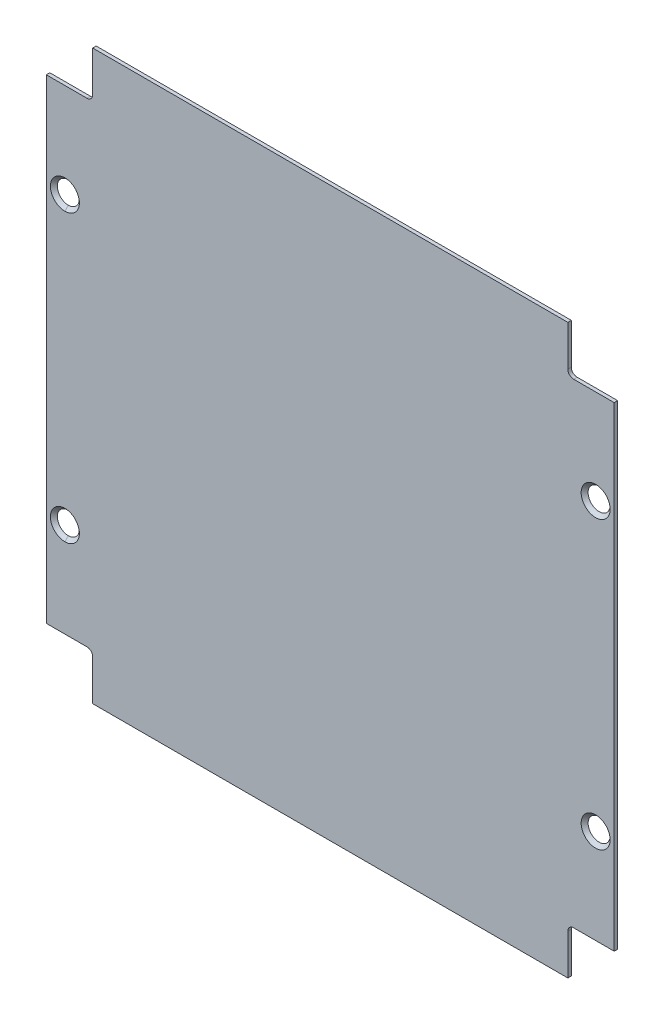
ISO-10303-21;
HEADER;
FILE_DESCRIPTION(('STEP AP214'),'2;1');
FILE_NAME('part.step','',(''),(''),'','','');
FILE_SCHEMA(('AUTOMOTIVE_DESIGN { 1 0 10303 214 1 1 1 1 }'));
ENDSEC;
DATA;
#1=APPLICATION_CONTEXT('core data for automotive mechanical design processes');
#2=APPLICATION_PROTOCOL_DEFINITION('international standard','automotive_design',2000,#1);
#3=PRODUCT_CONTEXT('',#1,'mechanical');
#4=PRODUCT('Part','Part','',(#3));
#5=PRODUCT_RELATED_PRODUCT_CATEGORY('part','',(#4));
#6=PRODUCT_DEFINITION_FORMATION('','',#4);
#7=PRODUCT_DEFINITION_CONTEXT('part definition',#1,'design');
#8=PRODUCT_DEFINITION('design','',#6,#7);
#9=PRODUCT_DEFINITION_SHAPE('','',#8);
#10=(LENGTH_UNIT() NAMED_UNIT(*) SI_UNIT(.MILLI.,.METRE.));
#11=(NAMED_UNIT(*) PLANE_ANGLE_UNIT() SI_UNIT($,.RADIAN.));
#12=(NAMED_UNIT(*) SI_UNIT($,.STERADIAN.) SOLID_ANGLE_UNIT());
#13=UNCERTAINTY_MEASURE_WITH_UNIT(LENGTH_MEASURE(1.E-05),#10,'distance_accuracy_value','');
#14=(GEOMETRIC_REPRESENTATION_CONTEXT(3) GLOBAL_UNCERTAINTY_ASSIGNED_CONTEXT((#13)) GLOBAL_UNIT_ASSIGNED_CONTEXT((#10,
#11,#12)) REPRESENTATION_CONTEXT('',''));
#15=CARTESIAN_POINT('',(0.,0.,0.));
#16=DIRECTION('',(0.,0.,1.));
#17=DIRECTION('',(1.,0.,0.));
#18=AXIS2_PLACEMENT_3D('',#15,#16,#17);
#19=CARTESIAN_POINT('',(50.0000000000032,-50.0000000000032,220.050000000009));
#20=DIRECTION('',(0.,0.,1.));
#21=DIRECTION('',(1.,0.,0.));
#22=AXIS2_PLACEMENT_3D('',#19,#20,#21);
#23=PLANE('',#22);
#24=CARTESIAN_POINT('',(4.20000000000099,-25.3000000000004,220.050000000009));
#25=DIRECTION('',(0.,0.,1.));
#26=DIRECTION('',(1.,0.,0.));
#27=AXIS2_PLACEMENT_3D('',#24,#25,#26);
#28=CIRCLE('',#27,2.50000738707968);
#29=CARTESIAN_POINT('',(4.20000000000098,-22.8000039421319,220.049994335404));
#30=VERTEX_POINT('',#29);
#31=CARTESIAN_POINT('',(4.20000000000098,-27.7999960578594,220.049994335404));
#32=VERTEX_POINT('',#31);
#33=EDGE_CURVE('E186',#30,#32,#28,.F.);
#34=ORIENTED_EDGE('',*,*,#33,.T.);
#35=CARTESIAN_POINT('',(4.20000000000098,-25.3000000000004,220.050000000009));
#36=DIRECTION('',(0.,0.,1.));
#37=DIRECTION('',(1.,0.,0.));
#38=AXIS2_PLACEMENT_3D('',#35,#36,#37);
#39=CIRCLE('',#38,2.50000738707967);
#40=EDGE_CURVE('E354',#32,#30,#39,.F.);
#41=ORIENTED_EDGE('',*,*,#40,.T.);
#42=EDGE_LOOP('',(#34,#41));
#43=FACE_BOUND('',#42,.T.);
#44=CARTESIAN_POINT('',(95.7999999999978,-25.3000000000004,220.050000000009));
#45=DIRECTION('',(0.,0.,1.));
#46=DIRECTION('',(1.,0.,0.));
#47=AXIS2_PLACEMENT_3D('',#44,#45,#46);
#48=CIRCLE('',#47,2.50000738711097);
#49=CARTESIAN_POINT('',(98.3000073871088,-25.3000000000004,220.050000000009));
#50=VERTEX_POINT('',#49);
#51=EDGE_CURVE('E359',#50,#50,#48,.F.);
#52=ORIENTED_EDGE('',*,*,#51,.T.);
#53=EDGE_LOOP('',(#52));
#54=FACE_BOUND('',#53,.T.);
#55=CARTESIAN_POINT('',(95.7999999999978,-74.700000000006,220.050000000009));
#56=DIRECTION('',(0.,0.,1.));
#57=DIRECTION('',(1.,0.,0.));
#58=AXIS2_PLACEMENT_3D('',#55,#56,#57);
#59=CIRCLE('',#58,2.50000738711097);
#60=CARTESIAN_POINT('',(98.3000073871088,-74.700000000006,220.050000000009));
#61=VERTEX_POINT('',#60);
#62=EDGE_CURVE('E201',#61,#61,#59,.F.);
#63=ORIENTED_EDGE('',*,*,#62,.T.);
#64=EDGE_LOOP('',(#63));
#65=FACE_BOUND('',#64,.T.);
#66=CARTESIAN_POINT('',(4.20000000000099,-74.700000000006,220.050000000009));
#67=DIRECTION('',(0.,0.,1.));
#68=DIRECTION('',(1.,0.,0.));
#69=AXIS2_PLACEMENT_3D('',#66,#67,#68);
#70=CIRCLE('',#69,2.50000738707968);
#71=CARTESIAN_POINT('',(4.20000000000098,-72.200003942137,220.049994335404));
#72=VERTEX_POINT('',#71);
#73=CARTESIAN_POINT('',(4.20000000000098,-77.1999960578627,220.049994335404));
#74=VERTEX_POINT('',#73);
#75=EDGE_CURVE('E196',#72,#74,#70,.F.);
#76=ORIENTED_EDGE('',*,*,#75,.T.);
#77=CARTESIAN_POINT('',(4.20000000000098,-74.700000000006,220.050000000009));
#78=DIRECTION('',(0.,0.,1.));
#79=DIRECTION('',(1.,0.,0.));
#80=AXIS2_PLACEMENT_3D('',#77,#78,#79);
#81=CIRCLE('',#80,2.50000738707967);
#82=EDGE_CURVE('E206',#74,#72,#81,.F.);
#83=ORIENTED_EDGE('',*,*,#82,.T.);
#84=EDGE_LOOP('',(#76,#83));
#85=FACE_BOUND('',#84,.T.);
#86=DIRECTION('',(0.,1.,0.));
#87=VECTOR('',#86,1.);
#88=CARTESIAN_POINT('',(8.99999999999956,-4.49999999999978,220.050000000009));
#89=LINE('',#88,#87);
#90=CARTESIAN_POINT('',(8.99999999999956,-1.00000000000006,220.050000000009));
#91=VERTEX_POINT('',#90);
#92=CARTESIAN_POINT('',(8.99999999999956,-8.00000000000102,220.050000000009));
#93=VERTEX_POINT('',#92);
#94=EDGE_CURVE('E207',#91,#93,#89,.F.);
#95=ORIENTED_EDGE('',*,*,#94,.T.);
#96=CARTESIAN_POINT('',(8.00000000000102,-8.00000000000102,220.050000000009));
#97=DIRECTION('',(0.,0.,1.));
#98=DIRECTION('',(1.,0.,0.));
#99=AXIS2_PLACEMENT_3D('',#96,#97,#98);
#100=CIRCLE('',#99,1.00000000000006);
#101=CARTESIAN_POINT('',(8.00000000000102,-8.99999999999956,220.050000000009));
#102=VERTEX_POINT('',#101);
#103=EDGE_CURVE('E20',#93,#102,#100,.F.);
#104=ORIENTED_EDGE('',*,*,#103,.T.);
#105=DIRECTION('',(1.,0.,0.));
#106=VECTOR('',#105,1.);
#107=CARTESIAN_POINT('',(4.49999999999978,-8.99999999999956,220.050000000009));
#108=LINE('',#107,#106);
#109=CARTESIAN_POINT('',(1.00000000000006,-8.99999999999956,220.050000000009));
#110=VERTEX_POINT('',#109);
#111=EDGE_CURVE('E293',#110,#102,#108,.T.);
#112=ORIENTED_EDGE('',*,*,#111,.F.);
#113=DIRECTION('',(0.,1.,0.));
#114=VECTOR('',#113,1.);
#115=CARTESIAN_POINT('',(1.00000000000006,-50.0000000000032,220.050000000009));
#116=LINE('',#115,#114);
#117=CARTESIAN_POINT('',(1.00000000000006,-90.9999999999916,220.050000000009));
#118=VERTEX_POINT('',#117);
#119=EDGE_CURVE('E156',#110,#118,#116,.F.);
#120=ORIENTED_EDGE('',*,*,#119,.T.);
#121=DIRECTION('',(1.,0.,0.));
#122=VECTOR('',#121,1.);
#123=CARTESIAN_POINT('',(4.49999999999978,-90.9999999999916,220.050000000009));
#124=LINE('',#123,#122);
#125=CARTESIAN_POINT('',(8.00000000000102,-90.9999999999896,220.050000000009));
#126=VERTEX_POINT('',#125);
#127=EDGE_CURVE('E283',#118,#126,#124,.T.);
#128=ORIENTED_EDGE('',*,*,#127,.T.);
#129=CARTESIAN_POINT('',(8.00000000000102,-91.9999999999876,220.050000000009));
#130=DIRECTION('',(0.,0.,1.));
#131=DIRECTION('',(1.,0.,0.));
#132=AXIS2_PLACEMENT_3D('',#129,#130,#131);
#133=CIRCLE('',#132,1.00000000000006);
#134=CARTESIAN_POINT('',(8.99999999999956,-91.9999999999876,220.050000000009));
#135=VERTEX_POINT('',#134);
#136=EDGE_CURVE('E279',#126,#135,#133,.F.);
#137=ORIENTED_EDGE('',*,*,#136,.T.);
#138=DIRECTION('',(0.,1.,0.));
#139=VECTOR('',#138,1.);
#140=CARTESIAN_POINT('',(8.99999999999956,-95.499999999999,220.050000000009));
#141=LINE('',#140,#139);
#142=CARTESIAN_POINT('',(8.99999999999956,-99.0000000000104,220.050000000009));
#143=VERTEX_POINT('',#142);
#144=EDGE_CURVE('E273',#135,#143,#141,.F.);
#145=ORIENTED_EDGE('',*,*,#144,.T.);
#146=DIRECTION('',(1.,0.,0.));
#147=VECTOR('',#146,1.);
#148=CARTESIAN_POINT('',(50.0000000000032,-99.0000000000104,220.050000000009));
#149=LINE('',#148,#147);
#150=CARTESIAN_POINT('',(90.9999999999916,-99.0000000000104,220.050000000009));
#151=VERTEX_POINT('',#150);
#152=EDGE_CURVE('E272',#143,#151,#149,.T.);
#153=ORIENTED_EDGE('',*,*,#152,.T.);
#154=DIRECTION('',(0.,1.,0.));
#155=VECTOR('',#154,1.);
#156=CARTESIAN_POINT('',(90.9999999999916,-95.499999999999,220.050000000009));
#157=LINE('',#156,#155);
#158=CARTESIAN_POINT('',(90.9999999999896,-91.9999999999876,220.050000000009));
#159=VERTEX_POINT('',#158);
#160=EDGE_CURVE('E259',#159,#151,#157,.F.);
#161=ORIENTED_EDGE('',*,*,#160,.F.);
#162=CARTESIAN_POINT('',(91.9999999999876,-91.9999999999876,220.050000000009));
#163=DIRECTION('',(0.,0.,1.));
#164=DIRECTION('',(1.,0.,0.));
#165=AXIS2_PLACEMENT_3D('',#162,#163,#164);
#166=CIRCLE('',#165,1.00000000000006);
#167=CARTESIAN_POINT('',(91.9999999999876,-90.9999999999916,220.050000000009));
#168=VERTEX_POINT('',#167);
#169=EDGE_CURVE('E253',#159,#168,#166,.F.);
#170=ORIENTED_EDGE('',*,*,#169,.T.);
#171=DIRECTION('',(1.,0.,0.));
#172=VECTOR('',#171,1.);
#173=CARTESIAN_POINT('',(95.499999999999,-90.9999999999916,220.050000000009));
#174=LINE('',#173,#172);
#175=CARTESIAN_POINT('',(99.0000000000104,-90.9999999999916,220.050000000009));
#176=VERTEX_POINT('',#175);
#177=EDGE_CURVE('E252',#168,#176,#174,.T.);
#178=ORIENTED_EDGE('',*,*,#177,.T.);
#179=DIRECTION('',(0.,1.,0.));
#180=VECTOR('',#179,1.);
#181=CARTESIAN_POINT('',(99.0000000000104,-50.0000000000032,220.050000000009));
#182=LINE('',#181,#180);
#183=CARTESIAN_POINT('',(99.0000000000104,-8.99999999999956,220.050000000009));
#184=VERTEX_POINT('',#183);
#185=EDGE_CURVE('E246',#184,#176,#182,.F.);
#186=ORIENTED_EDGE('',*,*,#185,.F.);
#187=DIRECTION('',(1.,0.,0.));
#188=VECTOR('',#187,1.);
#189=CARTESIAN_POINT('',(95.499999999999,-8.99999999999956,220.050000000009));
#190=LINE('',#189,#188);
#191=CARTESIAN_POINT('',(91.9999999999876,-9.00000000000032,220.050000000009));
#192=VERTEX_POINT('',#191);
#193=EDGE_CURVE('E234',#192,#184,#190,.T.);
#194=ORIENTED_EDGE('',*,*,#193,.F.);
#195=CARTESIAN_POINT('',(91.9999999999876,-8.00000000000102,220.050000000009));
#196=DIRECTION('',(0.,0.,1.));
#197=DIRECTION('',(1.,0.,0.));
#198=AXIS2_PLACEMENT_3D('',#195,#196,#197);
#199=CIRCLE('',#198,1.00000000000006);
#200=CARTESIAN_POINT('',(90.9999999999916,-8.00000000000102,220.050000000009));
#201=VERTEX_POINT('',#200);
#202=EDGE_CURVE('E231',#192,#201,#199,.F.);
#203=ORIENTED_EDGE('',*,*,#202,.T.);
#204=DIRECTION('',(0.,1.,0.));
#205=VECTOR('',#204,1.);
#206=CARTESIAN_POINT('',(90.9999999999916,-4.49999999999978,220.050000000009));
#207=LINE('',#206,#205);
#208=CARTESIAN_POINT('',(90.9999999999916,-1.00000000000006,220.050000000009));
#209=VERTEX_POINT('',#208);
#210=EDGE_CURVE('E227',#209,#201,#207,.F.);
#211=ORIENTED_EDGE('',*,*,#210,.F.);
#212=DIRECTION('',(1.,0.,0.));
#213=VECTOR('',#212,1.);
#214=CARTESIAN_POINT('',(50.0000000000032,-1.00000000000006,220.050000000009));
#215=LINE('',#214,#213);
#216=EDGE_CURVE('E121',#91,#209,#215,.T.);
#217=ORIENTED_EDGE('',*,*,#216,.F.);
#218=EDGE_LOOP('',(#95,#104,#112,#120,#128,#137,#145,#153,#161,#170,#178,#186,#194,#203,#211,#217));
#219=FACE_BOUND('',#218,.T.);
#220=ADVANCED_FACE('F17',(#43,#54,#65,#85,#219),#23,.T.);
#221=CARTESIAN_POINT('',(8.00000000000102,-8.00000000000102,219.283686926491));
#222=DIRECTION('',(0.,0.,1.));
#223=DIRECTION('',(1.,0.,0.));
#224=AXIS2_PLACEMENT_3D('',#221,#222,#223);
#225=CYLINDRICAL_SURFACE('',#224,1.00000000000006);
#226=ORIENTED_EDGE('',*,*,#103,.F.);
#227=DIRECTION('',(0.,0.,-1.));
#228=VECTOR('',#227,1.);
#229=CARTESIAN_POINT('',(8.99999999999956,-8.00000000000102,219.75000000001));
#230=LINE('',#229,#228);
#231=CARTESIAN_POINT('',(8.99999999999956,-8.00000000000102,219.450000000011));
#232=VERTEX_POINT('',#231);
#233=EDGE_CURVE('E204',#93,#232,#230,.T.);
#234=ORIENTED_EDGE('',*,*,#233,.T.);
#235=CARTESIAN_POINT('',(8.00000000000102,-8.00000000000102,219.450000000011));
#236=DIRECTION('',(0.,0.,1.));
#237=DIRECTION('',(1.,0.,0.));
#238=AXIS2_PLACEMENT_3D('',#235,#236,#237);
#239=CIRCLE('',#238,1.00000000000006);
#240=CARTESIAN_POINT('',(8.00000000000102,-8.99999999999956,219.450000000011));
#241=VERTEX_POINT('',#240);
#242=EDGE_CURVE('E174',#232,#241,#239,.F.);
#243=ORIENTED_EDGE('',*,*,#242,.T.);
#244=DIRECTION('',(0.,0.,1.));
#245=VECTOR('',#244,1.);
#246=CARTESIAN_POINT('',(8.00000000000102,-8.99999999999956,219.75000000001));
#247=LINE('',#246,#245);
#248=EDGE_CURVE('E160',#102,#241,#247,.F.);
#249=ORIENTED_EDGE('',*,*,#248,.F.);
#250=EDGE_LOOP('',(#226,#234,#243,#249));
#251=FACE_BOUND('',#250,.T.);
#252=ADVANCED_FACE('F646',(#251),#225,.F.);
#253=CARTESIAN_POINT('',(4.49999999999978,-8.99999999999956,219.75000000001));
#254=DIRECTION('',(0.,1.,0.));
#255=DIRECTION('',(0.,0.,1.));
#256=AXIS2_PLACEMENT_3D('',#253,#254,#255);
#257=PLANE('',#256);
#258=ORIENTED_EDGE('',*,*,#248,.T.);
#259=DIRECTION('',(1.,0.,0.));
#260=VECTOR('',#259,1.);
#261=CARTESIAN_POINT('',(50.0000000000032,-8.99999999999956,219.450000000011));
#262=LINE('',#261,#260);
#263=CARTESIAN_POINT('',(1.00000000000006,-8.99999999999956,219.450000000011));
#264=VERTEX_POINT('',#263);
#265=EDGE_CURVE('E167',#241,#264,#262,.F.);
#266=ORIENTED_EDGE('',*,*,#265,.T.);
#267=DIRECTION('',(0.,0.,-1.));
#268=VECTOR('',#267,1.);
#269=CARTESIAN_POINT('',(1.00000000000006,-8.99999999999956,219.75000000001));
#270=LINE('',#269,#268);
#271=EDGE_CURVE('E151',#264,#110,#270,.F.);
#272=ORIENTED_EDGE('',*,*,#271,.T.);
#273=ORIENTED_EDGE('',*,*,#111,.T.);
#274=EDGE_LOOP('',(#258,#266,#272,#273));
#275=FACE_BOUND('',#274,.T.);
#276=ADVANCED_FACE('F173',(#275),#257,.T.);
#277=CARTESIAN_POINT('',(1.00000000000006,-50.0000000000032,219.75000000001));
#278=DIRECTION('',(1.,0.,0.));
#279=DIRECTION('',(0.,0.,-1.));
#280=AXIS2_PLACEMENT_3D('',#277,#278,#279);
#281=PLANE('',#280);
#282=DIRECTION('',(0.,0.,1.));
#283=VECTOR('',#282,1.);
#284=CARTESIAN_POINT('',(1.00000000000006,-90.9999999999916,219.75000000001));
#285=LINE('',#284,#283);
#286=CARTESIAN_POINT('',(1.00000000000006,-90.9999999999916,219.450000000011));
#287=VERTEX_POINT('',#286);
#288=EDGE_CURVE('E284',#287,#118,#285,.T.);
#289=ORIENTED_EDGE('',*,*,#288,.T.);
#290=ORIENTED_EDGE('',*,*,#119,.F.);
#291=ORIENTED_EDGE('',*,*,#271,.F.);
#292=DIRECTION('',(0.,1.,0.));
#293=VECTOR('',#292,1.);
#294=CARTESIAN_POINT('',(1.00000000000006,-50.0000000000032,219.450000000011));
#295=LINE('',#294,#293);
#296=EDGE_CURVE('E155',#264,#287,#295,.F.);
#297=ORIENTED_EDGE('',*,*,#296,.T.);
#298=EDGE_LOOP('',(#289,#290,#291,#297));
#299=FACE_BOUND('',#298,.T.);
#300=ADVANCED_FACE('F154',(#299),#281,.F.);
#301=CARTESIAN_POINT('',(4.49999999999978,-90.9999999999916,219.75000000001));
#302=DIRECTION('',(0.,1.,0.));
#303=DIRECTION('',(0.,0.,1.));
#304=AXIS2_PLACEMENT_3D('',#301,#302,#303);
#305=PLANE('',#304);
#306=ORIENTED_EDGE('',*,*,#127,.F.);
#307=ORIENTED_EDGE('',*,*,#288,.F.);
#308=DIRECTION('',(1.,0.,0.));
#309=VECTOR('',#308,1.);
#310=CARTESIAN_POINT('',(50.0000000000032,-90.9999999999916,219.450000000011));
#311=LINE('',#310,#309);
#312=CARTESIAN_POINT('',(8.00000000000102,-90.9999999999896,219.450000000011));
#313=VERTEX_POINT('',#312);
#314=EDGE_CURVE('E171',#287,#313,#311,.T.);
#315=ORIENTED_EDGE('',*,*,#314,.T.);
#316=DIRECTION('',(0.,0.,1.));
#317=VECTOR('',#316,1.);
#318=CARTESIAN_POINT('',(8.00000000000102,-90.9999999999875,219.283686926491));
#319=LINE('',#318,#317);
#320=EDGE_CURVE('E280',#313,#126,#319,.T.);
#321=ORIENTED_EDGE('',*,*,#320,.T.);
#322=EDGE_LOOP('',(#306,#307,#315,#321));
#323=FACE_BOUND('',#322,.T.);
#324=ADVANCED_FACE('F392',(#323),#305,.F.);
#325=CARTESIAN_POINT('',(8.00000000000102,-91.9999999999876,219.283686926491));
#326=DIRECTION('',(0.,0.,1.));
#327=DIRECTION('',(1.,0.,0.));
#328=AXIS2_PLACEMENT_3D('',#325,#326,#327);
#329=CYLINDRICAL_SURFACE('',#328,1.00000000000006);
#330=ORIENTED_EDGE('',*,*,#136,.F.);
#331=ORIENTED_EDGE('',*,*,#320,.F.);
#332=CARTESIAN_POINT('',(8.00000000000102,-91.9999999999876,219.450000000011));
#333=DIRECTION('',(0.,0.,1.));
#334=DIRECTION('',(1.,0.,0.));
#335=AXIS2_PLACEMENT_3D('',#332,#333,#334);
#336=CIRCLE('',#335,1.00000000000006);
#337=CARTESIAN_POINT('',(8.99999999999956,-91.9999999999876,219.450000000011));
#338=VERTEX_POINT('',#337);
#339=EDGE_CURVE('E349',#313,#338,#336,.F.);
#340=ORIENTED_EDGE('',*,*,#339,.T.);
#341=DIRECTION('',(0.,0.,-1.));
#342=VECTOR('',#341,1.);
#343=CARTESIAN_POINT('',(8.99999999999956,-91.9999999999876,219.75000000001));
#344=LINE('',#343,#342);
#345=EDGE_CURVE('E276',#338,#135,#344,.F.);
#346=ORIENTED_EDGE('',*,*,#345,.T.);
#347=EDGE_LOOP('',(#330,#331,#340,#346));
#348=FACE_BOUND('',#347,.T.);
#349=ADVANCED_FACE('F389',(#348),#329,.F.);
#350=CARTESIAN_POINT('',(8.99999999999956,-95.499999999999,219.75000000001));
#351=DIRECTION('',(1.,0.,0.));
#352=DIRECTION('',(0.,0.,-1.));
#353=AXIS2_PLACEMENT_3D('',#350,#351,#352);
#354=PLANE('',#353);
#355=ORIENTED_EDGE('',*,*,#144,.F.);
#356=ORIENTED_EDGE('',*,*,#345,.F.);
#357=DIRECTION('',(0.,1.,0.));
#358=VECTOR('',#357,1.);
#359=CARTESIAN_POINT('',(8.99999999999956,-50.0000000000032,219.450000000011));
#360=LINE('',#359,#358);
#361=CARTESIAN_POINT('',(8.99999999999956,-99.0000000000104,219.450000000011));
#362=VERTEX_POINT('',#361);
#363=EDGE_CURVE('E266',#338,#362,#360,.F.);
#364=ORIENTED_EDGE('',*,*,#363,.T.);
#365=DIRECTION('',(0.,0.,1.));
#366=VECTOR('',#365,1.);
#367=CARTESIAN_POINT('',(8.99999999999956,-99.0000000000104,219.749999999985));
#368=LINE('',#367,#366);
#369=EDGE_CURVE('E269',#362,#143,#368,.T.);
#370=ORIENTED_EDGE('',*,*,#369,.T.);
#371=EDGE_LOOP('',(#355,#356,#364,#370));
#372=FACE_BOUND('',#371,.T.);
#373=ADVANCED_FACE('F386',(#372),#354,.F.);
#374=CARTESIAN_POINT('',(50.0000000000032,-99.0000000000104,219.749999999985));
#375=DIRECTION('',(0.,1.,0.));
#376=DIRECTION('',(0.,0.,1.));
#377=AXIS2_PLACEMENT_3D('',#374,#375,#376);
#378=PLANE('',#377);
#379=DIRECTION('',(0.,0.,-1.));
#380=VECTOR('',#379,1.);
#381=CARTESIAN_POINT('',(90.9999999999916,-99.0000000000104,219.75000000001));
#382=LINE('',#381,#380);
#383=CARTESIAN_POINT('',(90.9999999999916,-99.0000000000104,219.450000000011));
#384=VERTEX_POINT('',#383);
#385=EDGE_CURVE('E257',#151,#384,#382,.T.);
#386=ORIENTED_EDGE('',*,*,#385,.F.);
#387=ORIENTED_EDGE('',*,*,#152,.F.);
#388=ORIENTED_EDGE('',*,*,#369,.F.);
#389=DIRECTION('',(1.,0.,0.));
#390=VECTOR('',#389,1.);
#391=CARTESIAN_POINT('',(50.0000000000032,-99.0000000000104,219.450000000011));
#392=LINE('',#391,#390);
#393=EDGE_CURVE('E262',#362,#384,#392,.T.);
#394=ORIENTED_EDGE('',*,*,#393,.T.);
#395=EDGE_LOOP('',(#386,#387,#388,#394));
#396=FACE_BOUND('',#395,.T.);
#397=ADVANCED_FACE('F453',(#396),#378,.F.);
#398=CARTESIAN_POINT('',(90.9999999999916,-95.499999999999,219.75000000001));
#399=DIRECTION('',(1.,0.,0.));
#400=DIRECTION('',(0.,0.,-1.));
#401=AXIS2_PLACEMENT_3D('',#398,#399,#400);
#402=PLANE('',#401);
#403=ORIENTED_EDGE('',*,*,#385,.T.);
#404=DIRECTION('',(0.,1.,0.));
#405=VECTOR('',#404,1.);
#406=CARTESIAN_POINT('',(90.9999999999916,-50.0000000000032,219.450000000011));
#407=LINE('',#406,#405);
#408=CARTESIAN_POINT('',(90.9999999999896,-91.9999999999876,219.450000000011));
#409=VERTEX_POINT('',#408);
#410=EDGE_CURVE('E265',#384,#409,#407,.T.);
#411=ORIENTED_EDGE('',*,*,#410,.T.);
#412=DIRECTION('',(0.,0.,1.));
#413=VECTOR('',#412,1.);
#414=CARTESIAN_POINT('',(90.9999999999875,-91.9999999999876,219.283686926593));
#415=LINE('',#414,#413);
#416=EDGE_CURVE('E254',#409,#159,#415,.T.);
#417=ORIENTED_EDGE('',*,*,#416,.T.);
#418=ORIENTED_EDGE('',*,*,#160,.T.);
#419=EDGE_LOOP('',(#403,#411,#417,#418));
#420=FACE_BOUND('',#419,.T.);
#421=ADVANCED_FACE('F450',(#420),#402,.T.);
#422=CARTESIAN_POINT('',(91.9999999999876,-91.9999999999876,219.283686926593));
#423=DIRECTION('',(0.,0.,1.));
#424=DIRECTION('',(1.,0.,0.));
#425=AXIS2_PLACEMENT_3D('',#422,#423,#424);
#426=CYLINDRICAL_SURFACE('',#425,1.00000000000006);
#427=ORIENTED_EDGE('',*,*,#169,.F.);
#428=ORIENTED_EDGE('',*,*,#416,.F.);
#429=CARTESIAN_POINT('',(91.9999999999876,-91.9999999999876,219.450000000011));
#430=DIRECTION('',(0.,0.,1.));
#431=DIRECTION('',(1.,0.,0.));
#432=AXIS2_PLACEMENT_3D('',#429,#430,#431);
#433=CIRCLE('',#432,1.00000000000006);
#434=CARTESIAN_POINT('',(91.9999999999876,-90.9999999999916,219.450000000011));
#435=VERTEX_POINT('',#434);
#436=EDGE_CURVE('E346',#409,#435,#433,.F.);
#437=ORIENTED_EDGE('',*,*,#436,.T.);
#438=DIRECTION('',(0.,0.,1.));
#439=VECTOR('',#438,1.);
#440=CARTESIAN_POINT('',(91.9999999999876,-90.9999999999916,219.75000000001));
#441=LINE('',#440,#439);
#442=EDGE_CURVE('E249',#435,#168,#441,.T.);
#443=ORIENTED_EDGE('',*,*,#442,.T.);
#444=EDGE_LOOP('',(#427,#428,#437,#443));
#445=FACE_BOUND('',#444,.T.);
#446=ADVANCED_FACE('F448',(#445),#426,.F.);
#447=CARTESIAN_POINT('',(95.499999999999,-90.9999999999916,219.75000000001));
#448=DIRECTION('',(0.,1.,0.));
#449=DIRECTION('',(0.,0.,1.));
#450=AXIS2_PLACEMENT_3D('',#447,#448,#449);
#451=PLANE('',#450);
#452=ORIENTED_EDGE('',*,*,#177,.F.);
#453=ORIENTED_EDGE('',*,*,#442,.F.);
#454=DIRECTION('',(1.,0.,0.));
#455=VECTOR('',#454,1.);
#456=CARTESIAN_POINT('',(50.0000000000032,-90.9999999999916,219.450000000011));
#457=LINE('',#456,#455);
#458=CARTESIAN_POINT('',(99.0000000000104,-90.9999999999916,219.450000000011));
#459=VERTEX_POINT('',#458);
#460=EDGE_CURVE('E241',#435,#459,#457,.T.);
#461=ORIENTED_EDGE('',*,*,#460,.T.);
#462=DIRECTION('',(0.,0.,-1.));
#463=VECTOR('',#462,1.);
#464=CARTESIAN_POINT('',(99.0000000000104,-90.9999999999916,219.75000000001));
#465=LINE('',#464,#463);
#466=EDGE_CURVE('E244',#176,#459,#465,.T.);
#467=ORIENTED_EDGE('',*,*,#466,.F.);
#468=EDGE_LOOP('',(#452,#453,#461,#467));
#469=FACE_BOUND('',#468,.T.);
#470=ADVANCED_FACE('F443',(#469),#451,.F.);
#471=CARTESIAN_POINT('',(99.0000000000104,-50.0000000000032,219.75000000001));
#472=DIRECTION('',(1.,0.,0.));
#473=DIRECTION('',(0.,0.,-1.));
#474=AXIS2_PLACEMENT_3D('',#471,#472,#473);
#475=PLANE('',#474);
#476=DIRECTION('',(0.,1.,0.));
#477=VECTOR('',#476,1.);
#478=CARTESIAN_POINT('',(99.0000000000104,-50.0000000000032,219.450000000011));
#479=LINE('',#478,#477);
#480=CARTESIAN_POINT('',(99.0000000000104,-8.99999999999956,219.450000000011));
#481=VERTEX_POINT('',#480);
#482=EDGE_CURVE('E237',#459,#481,#479,.T.);
#483=ORIENTED_EDGE('',*,*,#482,.T.);
#484=DIRECTION('',(0.,0.,1.));
#485=VECTOR('',#484,1.);
#486=CARTESIAN_POINT('',(99.0000000000104,-8.99999999999956,219.75000000001));
#487=LINE('',#486,#485);
#488=EDGE_CURVE('E232',#184,#481,#487,.F.);
#489=ORIENTED_EDGE('',*,*,#488,.F.);
#490=ORIENTED_EDGE('',*,*,#185,.T.);
#491=ORIENTED_EDGE('',*,*,#466,.T.);
#492=EDGE_LOOP('',(#483,#489,#490,#491));
#493=FACE_BOUND('',#492,.T.);
#494=ADVANCED_FACE('F439',(#493),#475,.T.);
#495=CARTESIAN_POINT('',(95.499999999999,-8.99999999999956,219.75000000001));
#496=DIRECTION('',(0.,1.,0.));
#497=DIRECTION('',(0.,0.,1.));
#498=AXIS2_PLACEMENT_3D('',#495,#496,#497);
#499=PLANE('',#498);
#500=ORIENTED_EDGE('',*,*,#488,.T.);
#501=DIRECTION('',(1.,0.,0.));
#502=VECTOR('',#501,1.);
#503=CARTESIAN_POINT('',(50.0000000000032,-8.99999999999956,219.450000000011));
#504=LINE('',#503,#502);
#505=CARTESIAN_POINT('',(91.9999999999876,-9.00000000000032,219.450000000011));
#506=VERTEX_POINT('',#505);
#507=EDGE_CURVE('E240',#481,#506,#504,.F.);
#508=ORIENTED_EDGE('',*,*,#507,.T.);
#509=DIRECTION('',(0.,0.,1.));
#510=VECTOR('',#509,1.);
#511=CARTESIAN_POINT('',(91.9999999999876,-9.00000000000108,219.283686926593));
#512=LINE('',#511,#510);
#513=EDGE_CURVE('E228',#506,#192,#512,.T.);
#514=ORIENTED_EDGE('',*,*,#513,.T.);
#515=ORIENTED_EDGE('',*,*,#193,.T.);
#516=EDGE_LOOP('',(#500,#508,#514,#515));
#517=FACE_BOUND('',#516,.T.);
#518=ADVANCED_FACE('F433',(#517),#499,.T.);
#519=CARTESIAN_POINT('',(91.9999999999876,-8.00000000000102,219.283686926593));
#520=DIRECTION('',(0.,0.,1.));
#521=DIRECTION('',(1.,0.,0.));
#522=AXIS2_PLACEMENT_3D('',#519,#520,#521);
#523=CYLINDRICAL_SURFACE('',#522,1.00000000000006);
#524=ORIENTED_EDGE('',*,*,#202,.F.);
#525=ORIENTED_EDGE('',*,*,#513,.F.);
#526=CARTESIAN_POINT('',(91.9999999999876,-8.00000000000102,219.450000000011));
#527=DIRECTION('',(0.,0.,1.));
#528=DIRECTION('',(1.,0.,0.));
#529=AXIS2_PLACEMENT_3D('',#526,#527,#528);
#530=CIRCLE('',#529,1.00000000000006);
#531=CARTESIAN_POINT('',(90.9999999999916,-8.00000000000102,219.450000000011));
#532=VERTEX_POINT('',#531);
#533=EDGE_CURVE('E343',#506,#532,#530,.F.);
#534=ORIENTED_EDGE('',*,*,#533,.T.);
#535=DIRECTION('',(0.,0.,-1.));
#536=VECTOR('',#535,1.);
#537=CARTESIAN_POINT('',(90.9999999999916,-8.00000000000102,219.75000000001));
#538=LINE('',#537,#536);
#539=EDGE_CURVE('E225',#201,#532,#538,.T.);
#540=ORIENTED_EDGE('',*,*,#539,.F.);
#541=EDGE_LOOP('',(#524,#525,#534,#540));
#542=FACE_BOUND('',#541,.T.);
#543=ADVANCED_FACE('F431',(#542),#523,.F.);
#544=CARTESIAN_POINT('',(90.9999999999916,-4.49999999999978,219.75000000001));
#545=DIRECTION('',(1.,0.,0.));
#546=DIRECTION('',(0.,0.,-1.));
#547=AXIS2_PLACEMENT_3D('',#544,#545,#546);
#548=PLANE('',#547);
#549=ORIENTED_EDGE('',*,*,#539,.T.);
#550=DIRECTION('',(0.,1.,0.));
#551=VECTOR('',#550,1.);
#552=CARTESIAN_POINT('',(90.9999999999916,-50.0000000000032,219.450000000011));
#553=LINE('',#552,#551);
#554=CARTESIAN_POINT('',(90.9999999999916,-1.00000000000006,219.450000000011));
#555=VERTEX_POINT('',#554);
#556=EDGE_CURVE('E218',#532,#555,#553,.T.);
#557=ORIENTED_EDGE('',*,*,#556,.T.);
#558=DIRECTION('',(0.,0.,1.));
#559=VECTOR('',#558,1.);
#560=CARTESIAN_POINT('',(90.9999999999916,-1.00000000000006,219.749999999985));
#561=LINE('',#560,#559);
#562=EDGE_CURVE('E211',#209,#555,#561,.F.);
#563=ORIENTED_EDGE('',*,*,#562,.F.);
#564=ORIENTED_EDGE('',*,*,#210,.T.);
#565=EDGE_LOOP('',(#549,#557,#563,#564));
#566=FACE_BOUND('',#565,.T.);
#567=ADVANCED_FACE('F425',(#566),#548,.T.);
#568=CARTESIAN_POINT('',(50.0000000000032,-1.00000000000006,219.749999999985));
#569=DIRECTION('',(0.,1.,0.));
#570=DIRECTION('',(0.,0.,1.));
#571=AXIS2_PLACEMENT_3D('',#568,#569,#570);
#572=PLANE('',#571);
#573=DIRECTION('',(1.,0.,0.));
#574=VECTOR('',#573,1.);
#575=CARTESIAN_POINT('',(50.0000000000032,-1.00000000000006,219.450000000011));
#576=LINE('',#575,#574);
#577=CARTESIAN_POINT('',(8.99999999999956,-1.00000000000006,219.450000000011));
#578=VERTEX_POINT('',#577);
#579=EDGE_CURVE('E214',#555,#578,#576,.F.);
#580=ORIENTED_EDGE('',*,*,#579,.T.);
#581=DIRECTION('',(0.,0.,-1.));
#582=VECTOR('',#581,1.);
#583=CARTESIAN_POINT('',(8.99999999999956,-1.00000000000006,219.75000000001));
#584=LINE('',#583,#582);
#585=EDGE_CURVE('E208',#578,#91,#584,.F.);
#586=ORIENTED_EDGE('',*,*,#585,.T.);
#587=ORIENTED_EDGE('',*,*,#216,.T.);
#588=ORIENTED_EDGE('',*,*,#562,.T.);
#589=EDGE_LOOP('',(#580,#586,#587,#588));
#590=FACE_BOUND('',#589,.T.);
#591=ADVANCED_FACE('F422',(#590),#572,.T.);
#592=CARTESIAN_POINT('',(8.99999999999956,-4.49999999999978,219.75000000001));
#593=DIRECTION('',(1.,0.,0.));
#594=DIRECTION('',(0.,0.,-1.));
#595=AXIS2_PLACEMENT_3D('',#592,#593,#594);
#596=PLANE('',#595);
#597=ORIENTED_EDGE('',*,*,#94,.F.);
#598=ORIENTED_EDGE('',*,*,#585,.F.);
#599=DIRECTION('',(0.,1.,0.));
#600=VECTOR('',#599,1.);
#601=CARTESIAN_POINT('',(8.99999999999956,-50.0000000000032,219.450000000011));
#602=LINE('',#601,#600);
#603=EDGE_CURVE('E217',#578,#232,#602,.F.);
#604=ORIENTED_EDGE('',*,*,#603,.T.);
#605=ORIENTED_EDGE('',*,*,#233,.F.);
#606=EDGE_LOOP('',(#597,#598,#604,#605));
#607=FACE_BOUND('',#606,.T.);
#608=ADVANCED_FACE('F419',(#607),#596,.F.);
#609=CARTESIAN_POINT('',(4.20000000000098,-74.700000000006,220.049988670837));
#610=DIRECTION('',(0.,0.,1.));
#611=DIRECTION('',(1.,0.,0.));
#612=AXIS2_PLACEMENT_3D('',#609,#610,#611);
#613=CONICAL_SURFACE('',#612,2.49999605787454,0.785399640736247);
#614=CARTESIAN_POINT('',(4.20000000000098,-74.700000000006,219.449999999938));
#615=DIRECTION('',(0.,0.,1.));
#616=DIRECTION('',(1.,0.,0.));
#617=AXIS2_PLACEMENT_3D('',#614,#615,#616);
#618=CIRCLE('',#617,1.90000561419967);
#619=CARTESIAN_POINT('',(4.20000000000098,-76.6000056141525,219.450000000011));
#620=VERTEX_POINT('',#619);
#621=CARTESIAN_POINT('',(4.20000000000098,-72.7999943858756,219.449999999982));
#622=VERTEX_POINT('',#621);
#623=EDGE_CURVE('E341',#620,#622,#618,.F.);
#624=ORIENTED_EDGE('',*,*,#623,.T.);
#625=DIRECTION('',(0.,-0.707107825873441,-0.70710573649811));
#626=VECTOR('',#625,1.);
#627=CARTESIAN_POINT('',(4.20000000003153,498709.223815998,499000.));
#628=LINE('',#627,#626);
#629=EDGE_CURVE('E195',#622,#72,#628,.F.);
#630=ORIENTED_EDGE('',*,*,#629,.T.);
#631=ORIENTED_EDGE('',*,*,#82,.F.);
#632=DIRECTION('',(0.,0.707107825873441,-0.70710573649811));
#633=VECTOR('',#632,1.);
#634=CARTESIAN_POINT('',(4.19999999990936,-498858.623815998,499000.));
#635=LINE('',#634,#633);
#636=EDGE_CURVE('E192',#74,#620,#635,.T.);
#637=ORIENTED_EDGE('',*,*,#636,.T.);
#638=EDGE_LOOP('',(#624,#630,#631,#637));
#639=FACE_BOUND('',#638,.T.);
#640=ADVANCED_FACE('F489',(#639),#613,.F.);
#641=CARTESIAN_POINT('',(4.20000000000098,-74.700000000006,220.04998867078));
#642=DIRECTION('',(0.,0.,1.));
#643=DIRECTION('',(0.,-1.,0.));
#644=AXIS2_PLACEMENT_3D('',#641,#642,#643);
#645=CONICAL_SURFACE('',#644,2.4999960578177,0.785399640830988);
#646=CARTESIAN_POINT('',(4.20000000000098,-74.700000000006,219.450000000052));
#647=DIRECTION('',(0.,0.,1.));
#648=DIRECTION('',(0.,-1.,0.));
#649=AXIS2_PLACEMENT_3D('',#646,#647,#648);
#650=CIRCLE('',#649,1.90000561419967);
#651=EDGE_CURVE('E339',#622,#620,#650,.F.);
#652=ORIENTED_EDGE('',*,*,#651,.T.);
#653=ORIENTED_EDGE('',*,*,#636,.F.);
#654=ORIENTED_EDGE('',*,*,#75,.F.);
#655=ORIENTED_EDGE('',*,*,#629,.F.);
#656=EDGE_LOOP('',(#652,#653,#654,#655));
#657=FACE_BOUND('',#656,.T.);
#658=ADVANCED_FACE('F485',(#657),#645,.F.);
#659=CARTESIAN_POINT('',(95.7999999999978,-74.700000000006,220.049988670723));
#660=DIRECTION('',(0.,0.,1.));
#661=DIRECTION('',(1.,0.,0.));
#662=AXIS2_PLACEMENT_3D('',#659,#660,#661);
#663=CONICAL_SURFACE('',#662,2.49999605779215,0.785399640783618);
#664=CARTESIAN_POINT('',(95.7999999999978,-74.700000000006,219.449999999938));
#665=DIRECTION('',(0.,0.,1.));
#666=DIRECTION('',(1.,0.,0.));
#667=AXIS2_PLACEMENT_3D('',#664,#665,#666);
#668=CIRCLE('',#667,1.90000561417412);
#669=CARTESIAN_POINT('',(97.7000056141719,-74.700000000006,219.449999999938));
#670=VERTEX_POINT('',#669);
#671=EDGE_CURVE('E336',#670,#670,#668,.F.);
#672=ORIENTED_EDGE('',*,*,#671,.T.);
#673=EDGE_LOOP('',(#672));
#674=FACE_BOUND('',#673,.T.);
#675=ORIENTED_EDGE('',*,*,#62,.F.);
#676=EDGE_LOOP('',(#675));
#677=FACE_BOUND('',#676,.T.);
#678=ADVANCED_FACE('F481',(#674,#677),#663,.F.);
#679=CARTESIAN_POINT('',(95.7999999999978,-25.3000000000004,220.049988670723));
#680=DIRECTION('',(0.,0.,1.));
#681=DIRECTION('',(1.,0.,0.));
#682=AXIS2_PLACEMENT_3D('',#679,#680,#681);
#683=CONICAL_SURFACE('',#682,2.49999605779215,0.785399640783618);
#684=CARTESIAN_POINT('',(95.7999999999978,-25.3000000000004,219.449999999938));
#685=DIRECTION('',(0.,0.,1.));
#686=DIRECTION('',(1.,0.,0.));
#687=AXIS2_PLACEMENT_3D('',#684,#685,#686);
#688=CIRCLE('',#687,1.90000561417412);
#689=CARTESIAN_POINT('',(97.7000056141719,-25.3000000000004,219.449999999938));
#690=VERTEX_POINT('',#689);
#691=EDGE_CURVE('E333',#690,#690,#688,.F.);
#692=ORIENTED_EDGE('',*,*,#691,.T.);
#693=EDGE_LOOP('',(#692));
#694=FACE_BOUND('',#693,.T.);
#695=ORIENTED_EDGE('',*,*,#51,.F.);
#696=EDGE_LOOP('',(#695));
#697=FACE_BOUND('',#696,.T.);
#698=ADVANCED_FACE('F478',(#694,#697),#683,.F.);
#699=CARTESIAN_POINT('',(4.20000000000098,-25.3000000000004,220.049988670837));
#700=DIRECTION('',(0.,0.,1.));
#701=DIRECTION('',(1.,0.,0.));
#702=AXIS2_PLACEMENT_3D('',#699,#700,#701);
#703=CONICAL_SURFACE('',#702,2.49999605787454,0.785399640736247);
#704=CARTESIAN_POINT('',(4.20000000000098,-25.3000000000004,219.449999999938));
#705=DIRECTION('',(0.,0.,1.));
#706=DIRECTION('',(1.,0.,0.));
#707=AXIS2_PLACEMENT_3D('',#704,#705,#706);
#708=CIRCLE('',#707,1.90000561419967);
#709=CARTESIAN_POINT('',(4.20000000000098,-27.2000056141469,219.450000000011));
#710=VERTEX_POINT('',#709);
#711=CARTESIAN_POINT('',(4.20000000000098,-23.3999943857847,219.450000000039));
#712=VERTEX_POINT('',#711);
#713=EDGE_CURVE('E26',#710,#712,#708,.F.);
#714=ORIENTED_EDGE('',*,*,#713,.T.);
#715=DIRECTION('',(0.,-0.707107825873441,-0.70710573649811));
#716=VECTOR('',#715,1.);
#717=CARTESIAN_POINT('',(4.20000000003152,498758.623815998,499000.));
#718=LINE('',#717,#716);
#719=EDGE_CURVE('E176',#712,#30,#718,.F.);
#720=ORIENTED_EDGE('',*,*,#719,.T.);
#721=ORIENTED_EDGE('',*,*,#40,.F.);
#722=DIRECTION('',(0.,0.707107825873441,-0.70710573649811));
#723=VECTOR('',#722,1.);
#724=CARTESIAN_POINT('',(4.19999999990936,-498809.223815998,499000.));
#725=LINE('',#724,#723);
#726=EDGE_CURVE('E184',#32,#710,#725,.T.);
#727=ORIENTED_EDGE('',*,*,#726,.T.);
#728=EDGE_LOOP('',(#714,#720,#721,#727));
#729=FACE_BOUND('',#728,.T.);
#730=ADVANCED_FACE('F470',(#729),#703,.F.);
#731=CARTESIAN_POINT('',(4.20000000000098,-25.3000000000004,220.04998867078));
#732=DIRECTION('',(0.,0.,1.));
#733=DIRECTION('',(0.,-1.,0.));
#734=AXIS2_PLACEMENT_3D('',#731,#732,#733);
#735=CONICAL_SURFACE('',#734,2.4999960578177,0.785399640830988);
#736=CARTESIAN_POINT('',(4.20000000000098,-25.3000000000004,219.450000000052));
#737=DIRECTION('',(0.,0.,1.));
#738=DIRECTION('',(0.,-1.,0.));
#739=AXIS2_PLACEMENT_3D('',#736,#737,#738);
#740=CIRCLE('',#739,1.90000561419967);
#741=EDGE_CURVE('E11',#712,#710,#740,.F.);
#742=ORIENTED_EDGE('',*,*,#741,.T.);
#743=ORIENTED_EDGE('',*,*,#726,.F.);
#744=ORIENTED_EDGE('',*,*,#33,.F.);
#745=ORIENTED_EDGE('',*,*,#719,.F.);
#746=EDGE_LOOP('',(#742,#743,#744,#745));
#747=FACE_BOUND('',#746,.T.);
#748=ADVANCED_FACE('F464',(#747),#735,.F.);
#749=CARTESIAN_POINT('',(50.0000000000032,-50.0000000000032,219.450000000011));
#750=DIRECTION('',(0.,0.,1.));
#751=DIRECTION('',(1.,0.,0.));
#752=AXIS2_PLACEMENT_3D('',#749,#750,#751);
#753=PLANE('',#752);
#754=ORIENTED_EDGE('',*,*,#741,.F.);
#755=ORIENTED_EDGE('',*,*,#713,.F.);
#756=EDGE_LOOP('',(#754,#755));
#757=FACE_BOUND('',#756,.T.);
#758=ORIENTED_EDGE('',*,*,#691,.F.);
#759=EDGE_LOOP('',(#758));
#760=FACE_BOUND('',#759,.T.);
#761=ORIENTED_EDGE('',*,*,#671,.F.);
#762=EDGE_LOOP('',(#761));
#763=FACE_BOUND('',#762,.T.);
#764=ORIENTED_EDGE('',*,*,#651,.F.);
#765=ORIENTED_EDGE('',*,*,#623,.F.);
#766=EDGE_LOOP('',(#764,#765));
#767=FACE_BOUND('',#766,.T.);
#768=ORIENTED_EDGE('',*,*,#579,.F.);
#769=ORIENTED_EDGE('',*,*,#556,.F.);
#770=ORIENTED_EDGE('',*,*,#533,.F.);
#771=ORIENTED_EDGE('',*,*,#507,.F.);
#772=ORIENTED_EDGE('',*,*,#482,.F.);
#773=ORIENTED_EDGE('',*,*,#460,.F.);
#774=ORIENTED_EDGE('',*,*,#436,.F.);
#775=ORIENTED_EDGE('',*,*,#410,.F.);
#776=ORIENTED_EDGE('',*,*,#393,.F.);
#777=ORIENTED_EDGE('',*,*,#363,.F.);
#778=ORIENTED_EDGE('',*,*,#339,.F.);
#779=ORIENTED_EDGE('',*,*,#314,.F.);
#780=ORIENTED_EDGE('',*,*,#296,.F.);
#781=ORIENTED_EDGE('',*,*,#265,.F.);
#782=ORIENTED_EDGE('',*,*,#242,.F.);
#783=ORIENTED_EDGE('',*,*,#603,.F.);
#784=EDGE_LOOP('',(#768,#769,#770,#771,#772,#773,#774,#775,#776,#777,#778,#779,#780,#781,#782,#783));
#785=FACE_BOUND('',#784,.T.);
#786=ADVANCED_FACE('F166',(#757,#760,#763,#767,#785),#753,.F.);
#787=CLOSED_SHELL('',(#220,#252,#276,#300,#324,#349,#373,#397,#421,#446,#470,#494,#518,#543,
#567,#591,#608,#640,#658,#678,#698,#730,#748,#786));
#788=MANIFOLD_SOLID_BREP('B1',#787);
#789=ADVANCED_BREP_SHAPE_REPRESENTATION('',(#18,#788),#14);
#790=SHAPE_DEFINITION_REPRESENTATION(#9,#789);
ENDSEC;
END-ISO-10303-21;
